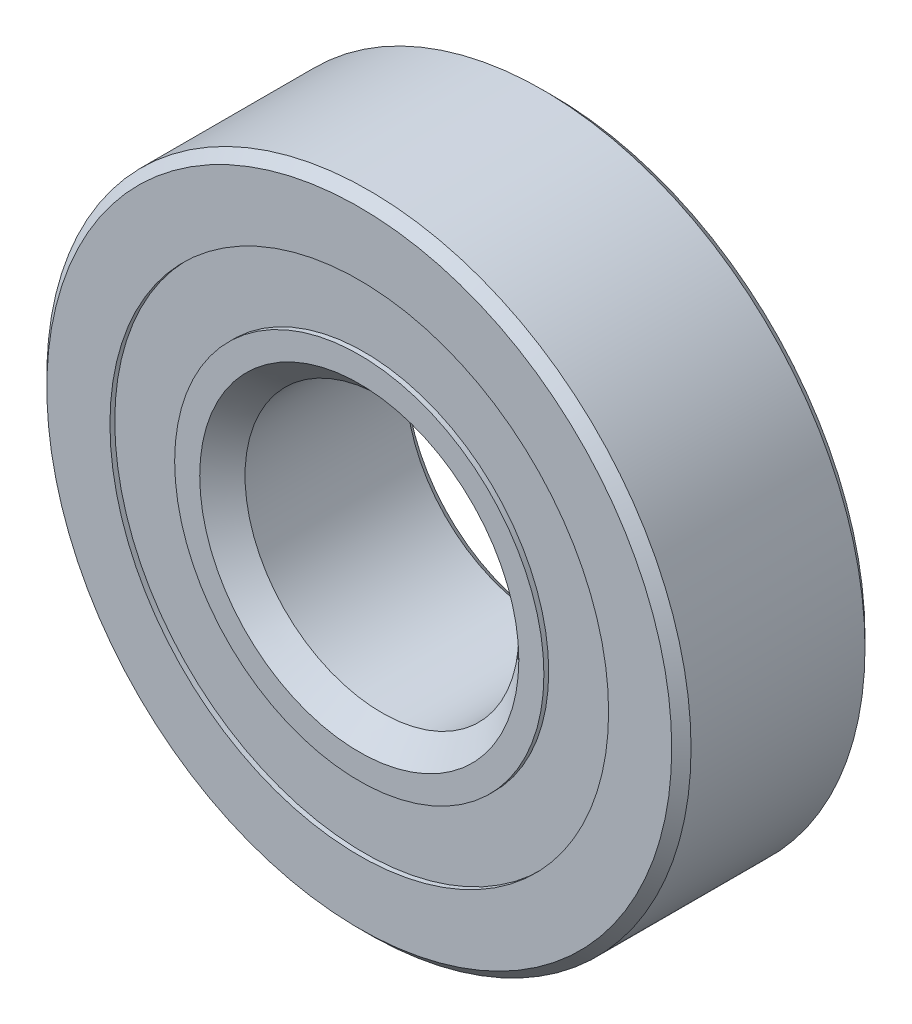
ISO-10303-21;
HEADER;
FILE_DESCRIPTION(('STEP AP214'),'2;1');
FILE_NAME('part.step','',(''),(''),'','','');
FILE_SCHEMA(('AUTOMOTIVE_DESIGN { 1 0 10303 214 1 1 1 1 }'));
ENDSEC;
DATA;
#1=APPLICATION_CONTEXT('core data for automotive mechanical design processes');
#2=APPLICATION_PROTOCOL_DEFINITION('international standard','automotive_design',2000,#1);
#3=PRODUCT_CONTEXT('',#1,'mechanical');
#4=PRODUCT('Part','Part','',(#3));
#5=PRODUCT_RELATED_PRODUCT_CATEGORY('part','',(#4));
#6=PRODUCT_DEFINITION_FORMATION('','',#4);
#7=PRODUCT_DEFINITION_CONTEXT('part definition',#1,'design');
#8=PRODUCT_DEFINITION('design','',#6,#7);
#9=PRODUCT_DEFINITION_SHAPE('','',#8);
#10=(LENGTH_UNIT() NAMED_UNIT(*) SI_UNIT(.MILLI.,.METRE.));
#11=(NAMED_UNIT(*) PLANE_ANGLE_UNIT() SI_UNIT($,.RADIAN.));
#12=(NAMED_UNIT(*) SI_UNIT($,.STERADIAN.) SOLID_ANGLE_UNIT());
#13=UNCERTAINTY_MEASURE_WITH_UNIT(LENGTH_MEASURE(1.E-05),#10,'distance_accuracy_value','');
#14=(GEOMETRIC_REPRESENTATION_CONTEXT(3) GLOBAL_UNCERTAINTY_ASSIGNED_CONTEXT((#13)) GLOBAL_UNIT_ASSIGNED_CONTEXT((#10,
#11,#12)) REPRESENTATION_CONTEXT('',''));
#15=CARTESIAN_POINT('',(0.,0.,0.));
#16=DIRECTION('',(0.,0.,1.));
#17=DIRECTION('',(1.,0.,0.));
#18=AXIS2_PLACEMENT_3D('',#15,#16,#17);
#19=CARTESIAN_POINT('',(0.,15.4807692307692,-5.70000000000001));
#20=DIRECTION('',(0.,0.,1.));
#21=DIRECTION('',(1.,0.,0.));
#22=AXIS2_PLACEMENT_3D('',#19,#20,#21);
#23=PLANE('',#22);
#24=CARTESIAN_POINT('',(0.,0.,-5.70000000000001));
#25=DIRECTION('',(0.,0.,1.));
#26=DIRECTION('',(1.,0.,0.));
#27=AXIS2_PLACEMENT_3D('',#24,#25,#26);
#28=CIRCLE('',#27,15.4807692307692);
#29=CARTESIAN_POINT('',(15.4807692307692,0.,-5.70000000000001));
#30=VERTEX_POINT('',#29);
#31=EDGE_CURVE('E62',#30,#30,#28,.T.);
#32=ORIENTED_EDGE('',*,*,#31,.F.);
#33=EDGE_LOOP('',(#32));
#34=FACE_BOUND('',#33,.T.);
#35=CARTESIAN_POINT('',(0.,0.,-5.70000000000001));
#36=DIRECTION('',(0.,0.,1.));
#37=DIRECTION('',(1.,0.,0.));
#38=AXIS2_PLACEMENT_3D('',#35,#36,#37);
#39=CIRCLE('',#38,11.4628681506012);
#40=CARTESIAN_POINT('',(11.4628681506012,0.,-5.70000000000001));
#41=VERTEX_POINT('',#40);
#42=EDGE_CURVE('E11',#41,#41,#39,.T.);
#43=ORIENTED_EDGE('',*,*,#42,.T.);
#44=EDGE_LOOP('',(#43));
#45=FACE_BOUND('',#44,.T.);
#46=ADVANCED_FACE('F48',(#34,#45),#23,.F.);
#47=CARTESIAN_POINT('',(0.,0.,6.));
#48=DIRECTION('',(0.,0.,1.));
#49=DIRECTION('',(1.,0.,0.));
#50=AXIS2_PLACEMENT_3D('',#47,#48,#49);
#51=CYLINDRICAL_SURFACE('',#50,11.4628681506012);
#52=ORIENTED_EDGE('',*,*,#42,.F.);
#53=EDGE_LOOP('',(#52));
#54=FACE_BOUND('',#53,.T.);
#55=CARTESIAN_POINT('',(0.,0.,-2.93698893605669));
#56=DIRECTION('',(0.,0.,1.));
#57=DIRECTION('',(1.,0.,0.));
#58=AXIS2_PLACEMENT_3D('',#55,#56,#57);
#59=CIRCLE('',#58,11.4628681506012);
#60=CARTESIAN_POINT('',(11.4628681506012,0.,-2.93698893605669));
#61=VERTEX_POINT('',#60);
#62=EDGE_CURVE('E54',#61,#61,#59,.T.);
#63=ORIENTED_EDGE('',*,*,#62,.T.);
#64=EDGE_LOOP('',(#63));
#65=FACE_BOUND('',#64,.T.);
#66=ADVANCED_FACE('F71',(#54,#65),#51,.F.);
#67=CARTESIAN_POINT('',(0.,15.4807692307692,-2.93698893605669));
#68=DIRECTION('',(0.,0.,-1.));
#69=DIRECTION('',(-1.,0.,0.));
#70=AXIS2_PLACEMENT_3D('',#67,#68,#69);
#71=PLANE('',#70);
#72=ORIENTED_EDGE('',*,*,#62,.F.);
#73=EDGE_LOOP('',(#72));
#74=FACE_BOUND('',#73,.T.);
#75=CARTESIAN_POINT('',(0.,0.,-2.93698893605669));
#76=DIRECTION('',(0.,0.,1.));
#77=DIRECTION('',(1.,0.,0.));
#78=AXIS2_PLACEMENT_3D('',#75,#76,#77);
#79=CIRCLE('',#78,15.4807692307692);
#80=CARTESIAN_POINT('',(15.4807692307692,0.,-2.93698893605669));
#81=VERTEX_POINT('',#80);
#82=EDGE_CURVE('E58',#81,#81,#79,.T.);
#83=ORIENTED_EDGE('',*,*,#82,.T.);
#84=EDGE_LOOP('',(#83));
#85=FACE_BOUND('',#84,.T.);
#86=ADVANCED_FACE('F75',(#74,#85),#71,.F.);
#87=CARTESIAN_POINT('',(0.,0.,6.));
#88=DIRECTION('',(0.,0.,1.));
#89=DIRECTION('',(1.,0.,0.));
#90=AXIS2_PLACEMENT_3D('',#87,#88,#89);
#91=CYLINDRICAL_SURFACE('',#90,15.4807692307692);
#92=ORIENTED_EDGE('',*,*,#82,.F.);
#93=EDGE_LOOP('',(#92));
#94=FACE_BOUND('',#93,.T.);
#95=ORIENTED_EDGE('',*,*,#31,.T.);
#96=EDGE_LOOP('',(#95));
#97=FACE_BOUND('',#96,.T.);
#98=ADVANCED_FACE('F68',(#94,#97),#91,.T.);
#99=CLOSED_SHELL('',(#46,#66,#86,#98));
#100=MANIFOLD_SOLID_BREP('B2',#99);
#101=CARTESIAN_POINT('',(0.,15.4807692307692,5.7));
#102=DIRECTION('',(0.,0.,-1.));
#103=DIRECTION('',(-1.,0.,0.));
#104=AXIS2_PLACEMENT_3D('',#101,#102,#103);
#105=PLANE('',#104);
#106=CARTESIAN_POINT('',(0.,0.,5.7));
#107=DIRECTION('',(0.,0.,1.));
#108=DIRECTION('',(1.,0.,0.));
#109=AXIS2_PLACEMENT_3D('',#106,#107,#108);
#110=CIRCLE('',#109,11.4628681506012);
#111=CARTESIAN_POINT('',(11.4628681506012,0.,5.7));
#112=VERTEX_POINT('',#111);
#113=EDGE_CURVE('E47',#112,#112,#110,.T.);
#114=ORIENTED_EDGE('',*,*,#113,.F.);
#115=EDGE_LOOP('',(#114));
#116=FACE_BOUND('',#115,.T.);
#117=CARTESIAN_POINT('',(0.,0.,5.7));
#118=DIRECTION('',(0.,0.,1.));
#119=DIRECTION('',(1.,0.,0.));
#120=AXIS2_PLACEMENT_3D('',#117,#118,#119);
#121=CIRCLE('',#120,15.4807692307692);
#122=CARTESIAN_POINT('',(15.4807692307692,0.,5.7));
#123=VERTEX_POINT('',#122);
#124=EDGE_CURVE('E130',#123,#123,#121,.T.);
#125=ORIENTED_EDGE('',*,*,#124,.T.);
#126=EDGE_LOOP('',(#125));
#127=FACE_BOUND('',#126,.T.);
#128=ADVANCED_FACE('F116',(#116,#127),#105,.F.);
#129=CARTESIAN_POINT('',(0.,0.,6.));
#130=DIRECTION('',(0.,0.,1.));
#131=DIRECTION('',(1.,0.,0.));
#132=AXIS2_PLACEMENT_3D('',#129,#130,#131);
#133=CYLINDRICAL_SURFACE('',#132,11.4628681506012);
#134=CARTESIAN_POINT('',(0.,0.,2.93698893605669));
#135=DIRECTION('',(0.,0.,1.));
#136=DIRECTION('',(1.,0.,0.));
#137=AXIS2_PLACEMENT_3D('',#134,#135,#136);
#138=CIRCLE('',#137,11.4628681506012);
#139=CARTESIAN_POINT('',(11.4628681506012,0.,2.93698893605669));
#140=VERTEX_POINT('',#139);
#141=EDGE_CURVE('E122',#140,#140,#138,.T.);
#142=ORIENTED_EDGE('',*,*,#141,.F.);
#143=EDGE_LOOP('',(#142));
#144=FACE_BOUND('',#143,.T.);
#145=ORIENTED_EDGE('',*,*,#113,.T.);
#146=EDGE_LOOP('',(#145));
#147=FACE_BOUND('',#146,.T.);
#148=ADVANCED_FACE('F145',(#144,#147),#133,.F.);
#149=CARTESIAN_POINT('',(0.,15.4807692307692,2.93698893605669));
#150=DIRECTION('',(0.,0.,1.));
#151=DIRECTION('',(1.,0.,0.));
#152=AXIS2_PLACEMENT_3D('',#149,#150,#151);
#153=PLANE('',#152);
#154=CARTESIAN_POINT('',(0.,0.,2.93698893605669));
#155=DIRECTION('',(0.,0.,1.));
#156=DIRECTION('',(1.,0.,0.));
#157=AXIS2_PLACEMENT_3D('',#154,#155,#156);
#158=CIRCLE('',#157,15.4807692307692);
#159=CARTESIAN_POINT('',(15.4807692307692,0.,2.93698893605669));
#160=VERTEX_POINT('',#159);
#161=EDGE_CURVE('E126',#160,#160,#158,.T.);
#162=ORIENTED_EDGE('',*,*,#161,.F.);
#163=EDGE_LOOP('',(#162));
#164=FACE_BOUND('',#163,.T.);
#165=ORIENTED_EDGE('',*,*,#141,.T.);
#166=EDGE_LOOP('',(#165));
#167=FACE_BOUND('',#166,.T.);
#168=ADVANCED_FACE('F140',(#164,#167),#153,.F.);
#169=CARTESIAN_POINT('',(0.,0.,6.));
#170=DIRECTION('',(0.,0.,1.));
#171=DIRECTION('',(1.,0.,0.));
#172=AXIS2_PLACEMENT_3D('',#169,#170,#171);
#173=CYLINDRICAL_SURFACE('',#172,15.4807692307692);
#174=ORIENTED_EDGE('',*,*,#124,.F.);
#175=EDGE_LOOP('',(#174));
#176=FACE_BOUND('',#175,.T.);
#177=ORIENTED_EDGE('',*,*,#161,.T.);
#178=EDGE_LOOP('',(#177));
#179=FACE_BOUND('',#178,.T.);
#180=ADVANCED_FACE('F137',(#176,#179),#173,.T.);
#181=CLOSED_SHELL('',(#128,#148,#168,#180));
#182=MANIFOLD_SOLID_BREP('B6',#181);
#183=CARTESIAN_POINT('',(-7.12499999999984,12.3408620039283,0.));
#184=DIRECTION('',(0.,0.,1.));
#185=DIRECTION('',(-0.499999999999989,0.866025403784445,0.));
#186=AXIS2_PLACEMENT_3D('',#183,#184,#185);
#187=SPHERICAL_SURFACE('',#186,2.93698893605669);
#188=CARTESIAN_POINT('',(-7.12499999999984,12.3408620039283,2.93698893605668));
#189=VERTEX_POINT('',#188);
#190=VERTEX_LOOP('',#189);
#191=FACE_BOUND('',#190,.T.);
#192=ADVANCED_FACE('F205',(#191),#187,.T.);
#193=CLOSED_SHELL('',(#192));
#194=MANIFOLD_SOLID_BREP('B42',#193);
#195=CARTESIAN_POINT('',(-12.3408620039282,7.12500000000014,0.));
#196=DIRECTION('',(0.,0.,1.));
#197=DIRECTION('',(-0.866025403784433,0.50000000000001,0.));
#198=AXIS2_PLACEMENT_3D('',#195,#196,#197);
#199=SPHERICAL_SURFACE('',#198,2.93698893605669);
#200=CARTESIAN_POINT('',(-12.3408620039282,7.12500000000014,2.93698893605668));
#201=VERTEX_POINT('',#200);
#202=VERTEX_LOOP('',#201);
#203=FACE_BOUND('',#202,.T.);
#204=ADVANCED_FACE('F241',(#203),#199,.T.);
#205=CLOSED_SHELL('',(#204));
#206=MANIFOLD_SOLID_BREP('B112',#205);
#207=CARTESIAN_POINT('',(-14.25,1.49260827235544E-13,0.));
#208=DIRECTION('',(0.,0.,1.));
#209=DIRECTION('',(-1.,0.,0.));
#210=AXIS2_PLACEMENT_3D('',#207,#208,#209);
#211=SPHERICAL_SURFACE('',#210,2.93698893605669);
#212=CARTESIAN_POINT('',(-14.25,1.49260827235544E-13,2.93698893605668));
#213=VERTEX_POINT('',#212);
#214=VERTEX_LOOP('',#213);
#215=FACE_BOUND('',#214,.T.);
#216=ADVANCED_FACE('F278',(#215),#211,.T.);
#217=CLOSED_SHELL('',(#216));
#218=MANIFOLD_SOLID_BREP('B201',#217);
#219=CARTESIAN_POINT('',(-12.3408620039283,-7.12499999999989,0.));
#220=DIRECTION('',(0.,0.,1.));
#221=DIRECTION('',(-0.866025403784443,-0.499999999999992,0.));
#222=AXIS2_PLACEMENT_3D('',#219,#220,#221);
#223=SPHERICAL_SURFACE('',#222,2.93698893605669);
#224=CARTESIAN_POINT('',(-12.3408620039283,-7.12499999999989,2.93698893605668));
#225=VERTEX_POINT('',#224);
#226=VERTEX_LOOP('',#225);
#227=FACE_BOUND('',#226,.T.);
#228=ADVANCED_FACE('F311',(#227),#223,.T.);
#229=CLOSED_SHELL('',(#228));
#230=MANIFOLD_SOLID_BREP('B237',#229);
#231=CARTESIAN_POINT('',(-7.1250000000001,-12.3408620039282,0.));
#232=DIRECTION('',(0.,0.,1.));
#233=DIRECTION('',(-0.500000000000007,-0.866025403784435,0.));
#234=AXIS2_PLACEMENT_3D('',#231,#232,#233);
#235=SPHERICAL_SURFACE('',#234,2.93698893605669);
#236=CARTESIAN_POINT('',(-7.1250000000001,-12.3408620039282,2.93698893605668));
#237=VERTEX_POINT('',#236);
#238=VERTEX_LOOP('',#237);
#239=FACE_BOUND('',#238,.T.);
#240=ADVANCED_FACE('F344',(#239),#235,.T.);
#241=CLOSED_SHELL('',(#240));
#242=MANIFOLD_SOLID_BREP('B274',#241);
#243=CARTESIAN_POINT('',(0.,-14.25,0.));
#244=DIRECTION('',(0.,0.,1.));
#245=DIRECTION('',(0.,-1.,0.));
#246=AXIS2_PLACEMENT_3D('',#243,#244,#245);
#247=SPHERICAL_SURFACE('',#246,2.93698893605669);
#248=CARTESIAN_POINT('',(0.,-14.25,2.93698893605668));
#249=VERTEX_POINT('',#248);
#250=VERTEX_LOOP('',#249);
#251=FACE_BOUND('',#250,.T.);
#252=ADVANCED_FACE('F377',(#251),#247,.T.);
#253=CLOSED_SHELL('',(#252));
#254=MANIFOLD_SOLID_BREP('B307',#253);
#255=CARTESIAN_POINT('',(7.12499999999993,-12.3408620039283,0.));
#256=DIRECTION('',(0.,0.,1.));
#257=DIRECTION('',(0.499999999999995,-0.866025403784442,0.));
#258=AXIS2_PLACEMENT_3D('',#255,#256,#257);
#259=SPHERICAL_SURFACE('',#258,2.93698893605669);
#260=CARTESIAN_POINT('',(7.12499999999993,-12.3408620039283,2.93698893605668));
#261=VERTEX_POINT('',#260);
#262=VERTEX_LOOP('',#261);
#263=FACE_BOUND('',#262,.T.);
#264=ADVANCED_FACE('F410',(#263),#259,.T.);
#265=CLOSED_SHELL('',(#264));
#266=MANIFOLD_SOLID_BREP('B340',#265);
#267=CARTESIAN_POINT('',(12.3408620039282,-7.12500000000006,0.));
#268=DIRECTION('',(0.,0.,1.));
#269=DIRECTION('',(0.866025403784436,-0.500000000000004,0.));
#270=AXIS2_PLACEMENT_3D('',#267,#268,#269);
#271=SPHERICAL_SURFACE('',#270,2.93698893605669);
#272=CARTESIAN_POINT('',(12.3408620039282,-7.12500000000006,2.93698893605668));
#273=VERTEX_POINT('',#272);
#274=VERTEX_LOOP('',#273);
#275=FACE_BOUND('',#274,.T.);
#276=ADVANCED_FACE('F443',(#275),#271,.T.);
#277=CLOSED_SHELL('',(#276));
#278=MANIFOLD_SOLID_BREP('B373',#277);
#279=CARTESIAN_POINT('',(14.25,0.,0.));
#280=DIRECTION('',(0.,0.,1.));
#281=DIRECTION('',(1.,0.,0.));
#282=AXIS2_PLACEMENT_3D('',#279,#280,#281);
#283=SPHERICAL_SURFACE('',#282,2.93698893605669);
#284=CARTESIAN_POINT('',(14.25,0.,2.93698893605668));
#285=VERTEX_POINT('',#284);
#286=VERTEX_LOOP('',#285);
#287=FACE_BOUND('',#286,.T.);
#288=ADVANCED_FACE('F476',(#287),#283,.T.);
#289=CLOSED_SHELL('',(#288));
#290=MANIFOLD_SOLID_BREP('B406',#289);
#291=CARTESIAN_POINT('',(12.3408620039283,7.12499999999997,0.));
#292=DIRECTION('',(0.,0.,1.));
#293=DIRECTION('',(0.86602540378444,0.499999999999998,0.));
#294=AXIS2_PLACEMENT_3D('',#291,#292,#293);
#295=SPHERICAL_SURFACE('',#294,2.93698893605669);
#296=CARTESIAN_POINT('',(12.3408620039283,7.12499999999997,2.93698893605668));
#297=VERTEX_POINT('',#296);
#298=VERTEX_LOOP('',#297);
#299=FACE_BOUND('',#298,.T.);
#300=ADVANCED_FACE('F509',(#299),#295,.T.);
#301=CLOSED_SHELL('',(#300));
#302=MANIFOLD_SOLID_BREP('B439',#301);
#303=CARTESIAN_POINT('',(7.12500000000001,12.3408620039282,0.));
#304=DIRECTION('',(0.,0.,1.));
#305=DIRECTION('',(0.500000000000001,0.866025403784438,0.));
#306=AXIS2_PLACEMENT_3D('',#303,#304,#305);
#307=SPHERICAL_SURFACE('',#306,2.93698893605669);
#308=CARTESIAN_POINT('',(7.12500000000001,12.3408620039282,2.93698893605668));
#309=VERTEX_POINT('',#308);
#310=VERTEX_LOOP('',#309);
#311=FACE_BOUND('',#310,.T.);
#312=ADVANCED_FACE('F542',(#311),#307,.T.);
#313=CLOSED_SHELL('',(#312));
#314=MANIFOLD_SOLID_BREP('B472',#313);
#315=CARTESIAN_POINT('',(0.,14.25,0.));
#316=DIRECTION('',(0.,0.,1.));
#317=DIRECTION('',(0.,1.,0.));
#318=AXIS2_PLACEMENT_3D('',#315,#316,#317);
#319=SPHERICAL_SURFACE('',#318,2.93698893605669);
#320=CARTESIAN_POINT('',(0.,14.25,2.93698893605668));
#321=VERTEX_POINT('',#320);
#322=VERTEX_LOOP('',#321);
#323=FACE_BOUND('',#322,.T.);
#324=ADVANCED_FACE('F577',(#323),#319,.T.);
#325=CLOSED_SHELL('',(#324));
#326=MANIFOLD_SOLID_BREP('B505',#325);
#327=CARTESIAN_POINT('',(0.,0.,6.));
#328=DIRECTION('',(0.,0.,1.));
#329=DIRECTION('',(1.,0.,0.));
#330=AXIS2_PLACEMENT_3D('',#327,#328,#329);
#331=CYLINDRICAL_SURFACE('',#330,11.4628681506012);
#332=CARTESIAN_POINT('',(0.,0.,6.));
#333=DIRECTION('',(0.,0.,1.));
#334=DIRECTION('',(1.,0.,0.));
#335=AXIS2_PLACEMENT_3D('',#332,#333,#334);
#336=CIRCLE('',#335,11.4628681506012);
#337=CARTESIAN_POINT('',(11.4628681506012,0.,6.));
#338=VERTEX_POINT('',#337);
#339=EDGE_CURVE('E637',#338,#338,#336,.T.);
#340=ORIENTED_EDGE('',*,*,#339,.F.);
#341=EDGE_LOOP('',(#340));
#342=FACE_BOUND('',#341,.T.);
#343=CARTESIAN_POINT('',(0.,0.,5.7));
#344=DIRECTION('',(0.,0.,1.));
#345=DIRECTION('',(1.,0.,0.));
#346=AXIS2_PLACEMENT_3D('',#343,#344,#345);
#347=CIRCLE('',#346,11.4628681506012);
#348=CARTESIAN_POINT('',(11.4628681506012,0.,5.7));
#349=VERTEX_POINT('',#348);
#350=EDGE_CURVE('E576',#349,#349,#347,.T.);
#351=ORIENTED_EDGE('',*,*,#350,.T.);
#352=EDGE_LOOP('',(#351));
#353=FACE_BOUND('',#352,.T.);
#354=ADVANCED_FACE('F597',(#342,#353),#331,.T.);
#355=CARTESIAN_POINT('',(0.,11.4628681506012,5.7));
#356=DIRECTION('',(0.,0.,1.));
#357=DIRECTION('',(1.,0.,0.));
#358=AXIS2_PLACEMENT_3D('',#355,#356,#357);
#359=PLANE('',#358);
#360=ORIENTED_EDGE('',*,*,#350,.F.);
#361=EDGE_LOOP('',(#360));
#362=FACE_BOUND('',#361,.T.);
#363=CARTESIAN_POINT('',(0.,0.,5.7));
#364=DIRECTION('',(0.,0.,1.));
#365=DIRECTION('',(1.,0.,0.));
#366=AXIS2_PLACEMENT_3D('',#363,#364,#365);
#367=CIRCLE('',#366,11.1628681506012);
#368=CARTESIAN_POINT('',(11.1628681506012,0.,5.7));
#369=VERTEX_POINT('',#368);
#370=EDGE_CURVE('E603',#369,#369,#367,.T.);
#371=ORIENTED_EDGE('',*,*,#370,.T.);
#372=EDGE_LOOP('',(#371));
#373=FACE_BOUND('',#372,.T.);
#374=ADVANCED_FACE('F644',(#362,#373),#359,.F.);
#375=CARTESIAN_POINT('',(0.,0.,4.44363738137045));
#376=DIRECTION('',(0.,0.,1.));
#377=DIRECTION('',(1.,0.,0.));
#378=AXIS2_PLACEMENT_3D('',#375,#376,#377);
#379=CONICAL_SURFACE('',#378,9.90650553197166,0.78539816339745);
#380=ORIENTED_EDGE('',*,*,#370,.F.);
#381=EDGE_LOOP('',(#380));
#382=FACE_BOUND('',#381,.T.);
#383=CARTESIAN_POINT('',(0.,0.,4.44363738137045));
#384=DIRECTION('',(0.,0.,1.));
#385=DIRECTION('',(1.,0.,0.));
#386=AXIS2_PLACEMENT_3D('',#383,#384,#385);
#387=CIRCLE('',#386,9.90650553197166);
#388=CARTESIAN_POINT('',(9.90650553197166,0.,4.44363738137045));
#389=VERTEX_POINT('',#388);
#390=EDGE_CURVE('E607',#389,#389,#387,.T.);
#391=ORIENTED_EDGE('',*,*,#390,.T.);
#392=EDGE_LOOP('',(#391));
#393=FACE_BOUND('',#392,.T.);
#394=ADVANCED_FACE('F648',(#382,#393),#379,.T.);
#395=CARTESIAN_POINT('',(0.,0.,6.));
#396=DIRECTION('',(0.,0.,1.));
#397=DIRECTION('',(1.,0.,0.));
#398=AXIS2_PLACEMENT_3D('',#395,#396,#397);
#399=CYLINDRICAL_SURFACE('',#398,9.90650553197166);
#400=ORIENTED_EDGE('',*,*,#390,.F.);
#401=EDGE_LOOP('',(#400));
#402=FACE_BOUND('',#401,.T.);
#403=CARTESIAN_POINT('',(0.,0.,0.));
#404=DIRECTION('',(0.,0.,1.));
#405=DIRECTION('',(1.,0.,0.));
#406=AXIS2_PLACEMENT_3D('',#403,#404,#405);
#407=CIRCLE('',#406,9.90650553197166);
#408=CARTESIAN_POINT('',(9.90650553197166,0.,0.));
#409=VERTEX_POINT('',#408);
#410=EDGE_CURVE('E611',#409,#409,#407,.T.);
#411=ORIENTED_EDGE('',*,*,#410,.T.);
#412=EDGE_LOOP('',(#411));
#413=FACE_BOUND('',#412,.T.);
#414=ADVANCED_FACE('F653',(#402,#413),#399,.T.);
#415=CARTESIAN_POINT('',(0.,9.90650553197166,0.));
#416=DIRECTION('',(0.,0.,-1.));
#417=DIRECTION('',(-1.,0.,0.));
#418=AXIS2_PLACEMENT_3D('',#415,#416,#417);
#419=PLANE('',#418);
#420=ORIENTED_EDGE('',*,*,#410,.F.);
#421=EDGE_LOOP('',(#420));
#422=FACE_BOUND('',#421,.T.);
#423=CARTESIAN_POINT('',(0.,0.,0.));
#424=DIRECTION('',(0.,0.,1.));
#425=DIRECTION('',(1.,0.,0.));
#426=AXIS2_PLACEMENT_3D('',#423,#424,#425);
#427=CIRCLE('',#426,11.3130110639433);
#428=CARTESIAN_POINT('',(11.3130110639433,0.,0.));
#429=VERTEX_POINT('',#428);
#430=EDGE_CURVE('E616',#429,#429,#427,.T.);
#431=ORIENTED_EDGE('',*,*,#430,.T.);
#432=EDGE_LOOP('',(#431));
#433=FACE_BOUND('',#432,.T.);
#434=ADVANCED_FACE('F659',(#422,#433),#419,.F.);
#435=CARTESIAN_POINT('',(0.,0.,0.));
#436=DIRECTION('',(0.,0.,1.));
#437=DIRECTION('',(1.,0.,0.));
#438=AXIS2_PLACEMENT_3D('',#435,#436,#437);
#439=TOROIDAL_SURFACE('',#438,14.25,2.93698893605668);
#440=ORIENTED_EDGE('',*,*,#430,.F.);
#441=EDGE_LOOP('',(#440));
#442=FACE_BOUND('',#441,.T.);
#443=CARTESIAN_POINT('',(0.,0.,-2.66666666666667));
#444=DIRECTION('',(0.,0.,1.));
#445=DIRECTION('',(1.,0.,0.));
#446=AXIS2_PLACEMENT_3D('',#443,#444,#445);
#447=CIRCLE('',#446,13.0192307692308);
#448=CARTESIAN_POINT('',(13.0192307692308,0.,-2.66666666666667));
#449=VERTEX_POINT('',#448);
#450=EDGE_CURVE('E619',#449,#449,#447,.T.);
#451=ORIENTED_EDGE('',*,*,#450,.T.);
#452=EDGE_LOOP('',(#451));
#453=FACE_BOUND('',#452,.T.);
#454=ADVANCED_FACE('F663',(#442,#453),#439,.F.);
#455=CARTESIAN_POINT('',(0.,0.,6.));
#456=DIRECTION('',(0.,0.,1.));
#457=DIRECTION('',(1.,0.,0.));
#458=AXIS2_PLACEMENT_3D('',#455,#456,#457);
#459=CYLINDRICAL_SURFACE('',#458,13.0192307692308);
#460=ORIENTED_EDGE('',*,*,#450,.F.);
#461=EDGE_LOOP('',(#460));
#462=FACE_BOUND('',#461,.T.);
#463=CARTESIAN_POINT('',(0.,0.,-6.00000000000001));
#464=DIRECTION('',(0.,0.,1.));
#465=DIRECTION('',(1.,0.,0.));
#466=AXIS2_PLACEMENT_3D('',#463,#464,#465);
#467=CIRCLE('',#466,13.0192307692308);
#468=CARTESIAN_POINT('',(13.0192307692308,0.,-6.00000000000001));
#469=VERTEX_POINT('',#468);
#470=EDGE_CURVE('E622',#469,#469,#467,.T.);
#471=ORIENTED_EDGE('',*,*,#470,.T.);
#472=EDGE_LOOP('',(#471));
#473=FACE_BOUND('',#472,.T.);
#474=ADVANCED_FACE('F667',(#462,#473),#459,.T.);
#475=CARTESIAN_POINT('',(0.,9.1,-6.00000000000001));
#476=DIRECTION('',(0.,0.,1.));
#477=DIRECTION('',(1.,0.,0.));
#478=AXIS2_PLACEMENT_3D('',#475,#476,#477);
#479=PLANE('',#478);
#480=ORIENTED_EDGE('',*,*,#470,.F.);
#481=EDGE_LOOP('',(#480));
#482=FACE_BOUND('',#481,.T.);
#483=CARTESIAN_POINT('',(0.,0.,-6.00000000000001));
#484=DIRECTION('',(0.,0.,1.));
#485=DIRECTION('',(1.,0.,0.));
#486=AXIS2_PLACEMENT_3D('',#483,#484,#485);
#487=CIRCLE('',#486,9.1);
#488=CARTESIAN_POINT('',(9.1,0.,-6.00000000000001));
#489=VERTEX_POINT('',#488);
#490=EDGE_CURVE('E625',#489,#489,#487,.T.);
#491=ORIENTED_EDGE('',*,*,#490,.T.);
#492=EDGE_LOOP('',(#491));
#493=FACE_BOUND('',#492,.T.);
#494=ADVANCED_FACE('F671',(#482,#493),#479,.F.);
#495=CARTESIAN_POINT('',(0.,0.,-5.40000000000001));
#496=DIRECTION('',(0.,0.,-1.));
#497=DIRECTION('',(-1.,0.,0.));
#498=AXIS2_PLACEMENT_3D('',#495,#496,#497);
#499=CONICAL_SURFACE('',#498,8.5,0.785398163397447);
#500=ORIENTED_EDGE('',*,*,#490,.F.);
#501=EDGE_LOOP('',(#500));
#502=FACE_BOUND('',#501,.T.);
#503=CARTESIAN_POINT('',(0.,0.,-5.40000000000001));
#504=DIRECTION('',(0.,0.,1.));
#505=DIRECTION('',(1.,0.,0.));
#506=AXIS2_PLACEMENT_3D('',#503,#504,#505);
#507=CIRCLE('',#506,8.5);
#508=CARTESIAN_POINT('',(8.5,0.,-5.40000000000001));
#509=VERTEX_POINT('',#508);
#510=EDGE_CURVE('E628',#509,#509,#507,.T.);
#511=ORIENTED_EDGE('',*,*,#510,.T.);
#512=EDGE_LOOP('',(#511));
#513=FACE_BOUND('',#512,.T.);
#514=ADVANCED_FACE('F675',(#502,#513),#499,.F.);
#515=CARTESIAN_POINT('',(0.,0.,6.));
#516=DIRECTION('',(0.,0.,1.));
#517=DIRECTION('',(1.,0.,0.));
#518=AXIS2_PLACEMENT_3D('',#515,#516,#517);
#519=CYLINDRICAL_SURFACE('',#518,8.5);
#520=ORIENTED_EDGE('',*,*,#510,.F.);
#521=EDGE_LOOP('',(#520));
#522=FACE_BOUND('',#521,.T.);
#523=CARTESIAN_POINT('',(0.,0.,4.59349446802835));
#524=DIRECTION('',(0.,0.,1.));
#525=DIRECTION('',(1.,0.,0.));
#526=AXIS2_PLACEMENT_3D('',#523,#524,#525);
#527=CIRCLE('',#526,8.5);
#528=CARTESIAN_POINT('',(8.5,0.,4.59349446802835));
#529=VERTEX_POINT('',#528);
#530=EDGE_CURVE('E631',#529,#529,#527,.T.);
#531=ORIENTED_EDGE('',*,*,#530,.T.);
#532=EDGE_LOOP('',(#531));
#533=FACE_BOUND('',#532,.T.);
#534=ADVANCED_FACE('F679',(#522,#533),#519,.F.);
#535=CARTESIAN_POINT('',(0.,0.,6.));
#536=DIRECTION('',(0.,0.,1.));
#537=DIRECTION('',(1.,0.,0.));
#538=AXIS2_PLACEMENT_3D('',#535,#536,#537);
#539=CONICAL_SURFACE('',#538,9.90650553197166,0.78539816339745);
#540=ORIENTED_EDGE('',*,*,#530,.F.);
#541=EDGE_LOOP('',(#540));
#542=FACE_BOUND('',#541,.T.);
#543=CARTESIAN_POINT('',(0.,0.,6.));
#544=DIRECTION('',(0.,0.,1.));
#545=DIRECTION('',(1.,0.,0.));
#546=AXIS2_PLACEMENT_3D('',#543,#544,#545);
#547=CIRCLE('',#546,9.90650553197166);
#548=CARTESIAN_POINT('',(9.90650553197166,0.,6.));
#549=VERTEX_POINT('',#548);
#550=EDGE_CURVE('E634',#549,#549,#547,.T.);
#551=ORIENTED_EDGE('',*,*,#550,.T.);
#552=EDGE_LOOP('',(#551));
#553=FACE_BOUND('',#552,.T.);
#554=ADVANCED_FACE('F683',(#542,#553),#539,.F.);
#555=CARTESIAN_POINT('',(0.,11.4628681506012,6.));
#556=DIRECTION('',(0.,0.,-1.));
#557=DIRECTION('',(-1.,0.,0.));
#558=AXIS2_PLACEMENT_3D('',#555,#556,#557);
#559=PLANE('',#558);
#560=ORIENTED_EDGE('',*,*,#550,.F.);
#561=EDGE_LOOP('',(#560));
#562=FACE_BOUND('',#561,.T.);
#563=ORIENTED_EDGE('',*,*,#339,.T.);
#564=EDGE_LOOP('',(#563));
#565=FACE_BOUND('',#564,.T.);
#566=ADVANCED_FACE('F641',(#562,#565),#559,.F.);
#567=CLOSED_SHELL('',(#354,#374,#394,#414,#434,#454,#474,#494,#514,#534,#554,#566));
#568=MANIFOLD_SOLID_BREP('B538',#567);
#569=CARTESIAN_POINT('',(0.,0.,5.4));
#570=DIRECTION('',(0.,0.,-1.));
#571=DIRECTION('',(-1.,0.,0.));
#572=AXIS2_PLACEMENT_3D('',#569,#570,#571);
#573=CONICAL_SURFACE('',#572,20.,0.785398163397451);
#574=CARTESIAN_POINT('',(0.,0.,6.));
#575=DIRECTION('',(0.,0.,1.));
#576=DIRECTION('',(1.,0.,0.));
#577=AXIS2_PLACEMENT_3D('',#574,#575,#576);
#578=CIRCLE('',#577,19.4);
#579=CARTESIAN_POINT('',(19.4,0.,6.));
#580=VERTEX_POINT('',#579);
#581=EDGE_CURVE('E807',#580,#580,#578,.T.);
#582=ORIENTED_EDGE('',*,*,#581,.F.);
#583=EDGE_LOOP('',(#582));
#584=FACE_BOUND('',#583,.T.);
#585=CARTESIAN_POINT('',(0.,0.,5.4));
#586=DIRECTION('',(0.,0.,1.));
#587=DIRECTION('',(1.,0.,0.));
#588=AXIS2_PLACEMENT_3D('',#585,#586,#587);
#589=CIRCLE('',#588,20.);
#590=CARTESIAN_POINT('',(20.,0.,5.4));
#591=VERTEX_POINT('',#590);
#592=EDGE_CURVE('E596',#591,#591,#589,.T.);
#593=ORIENTED_EDGE('',*,*,#592,.T.);
#594=EDGE_LOOP('',(#593));
#595=FACE_BOUND('',#594,.T.);
#596=ADVANCED_FACE('F779',(#584,#595),#573,.T.);
#597=CARTESIAN_POINT('',(0.,0.,6.));
#598=DIRECTION('',(0.,0.,1.));
#599=DIRECTION('',(1.,0.,0.));
#600=AXIS2_PLACEMENT_3D('',#597,#598,#599);
#601=CYLINDRICAL_SURFACE('',#600,20.);
#602=ORIENTED_EDGE('',*,*,#592,.F.);
#603=EDGE_LOOP('',(#602));
#604=FACE_BOUND('',#603,.T.);
#605=CARTESIAN_POINT('',(0.,0.,-5.40000000000001));
#606=DIRECTION('',(0.,0.,1.));
#607=DIRECTION('',(1.,0.,0.));
#608=AXIS2_PLACEMENT_3D('',#605,#606,#607);
#609=CIRCLE('',#608,20.);
#610=CARTESIAN_POINT('',(20.,0.,-5.40000000000001));
#611=VERTEX_POINT('',#610);
#612=EDGE_CURVE('E785',#611,#611,#609,.T.);
#613=ORIENTED_EDGE('',*,*,#612,.T.);
#614=EDGE_LOOP('',(#613));
#615=FACE_BOUND('',#614,.T.);
#616=ADVANCED_FACE('F814',(#604,#615),#601,.T.);
#617=CARTESIAN_POINT('',(0.,0.,-6.00000000000001));
#618=DIRECTION('',(0.,0.,1.));
#619=DIRECTION('',(1.,0.,0.));
#620=AXIS2_PLACEMENT_3D('',#617,#618,#619);
#621=CONICAL_SURFACE('',#620,19.4,0.785398163397451);
#622=ORIENTED_EDGE('',*,*,#612,.F.);
#623=EDGE_LOOP('',(#622));
#624=FACE_BOUND('',#623,.T.);
#625=CARTESIAN_POINT('',(0.,0.,-6.00000000000001));
#626=DIRECTION('',(0.,0.,1.));
#627=DIRECTION('',(1.,0.,0.));
#628=AXIS2_PLACEMENT_3D('',#625,#626,#627);
#629=CIRCLE('',#628,19.4);
#630=CARTESIAN_POINT('',(19.4,0.,-6.00000000000001));
#631=VERTEX_POINT('',#630);
#632=EDGE_CURVE('E789',#631,#631,#629,.T.);
#633=ORIENTED_EDGE('',*,*,#632,.T.);
#634=EDGE_LOOP('',(#633));
#635=FACE_BOUND('',#634,.T.);
#636=ADVANCED_FACE('F818',(#624,#635),#621,.T.);
#637=CARTESIAN_POINT('',(0.,19.4,-6.00000000000001));
#638=DIRECTION('',(0.,0.,1.));
#639=DIRECTION('',(1.,0.,0.));
#640=AXIS2_PLACEMENT_3D('',#637,#638,#639);
#641=PLANE('',#640);
#642=ORIENTED_EDGE('',*,*,#632,.F.);
#643=EDGE_LOOP('',(#642));
#644=FACE_BOUND('',#643,.T.);
#645=CARTESIAN_POINT('',(0.,0.,-6.00000000000001));
#646=DIRECTION('',(0.,0.,1.));
#647=DIRECTION('',(1.,0.,0.));
#648=AXIS2_PLACEMENT_3D('',#645,#646,#647);
#649=CIRCLE('',#648,15.4807692307692);
#650=CARTESIAN_POINT('',(15.4807692307692,0.,-6.00000000000001));
#651=VERTEX_POINT('',#650);
#652=EDGE_CURVE('E793',#651,#651,#649,.T.);
#653=ORIENTED_EDGE('',*,*,#652,.T.);
#654=EDGE_LOOP('',(#653));
#655=FACE_BOUND('',#654,.T.);
#656=ADVANCED_FACE('F823',(#644,#655),#641,.F.);
#657=CARTESIAN_POINT('',(0.,0.,6.));
#658=DIRECTION('',(0.,0.,1.));
#659=DIRECTION('',(1.,0.,0.));
#660=AXIS2_PLACEMENT_3D('',#657,#658,#659);
#661=CYLINDRICAL_SURFACE('',#660,15.4807692307692);
#662=ORIENTED_EDGE('',*,*,#652,.F.);
#663=EDGE_LOOP('',(#662));
#664=FACE_BOUND('',#663,.T.);
#665=CARTESIAN_POINT('',(0.,0.,-2.66666666666667));
#666=DIRECTION('',(0.,0.,1.));
#667=DIRECTION('',(1.,0.,0.));
#668=AXIS2_PLACEMENT_3D('',#665,#666,#667);
#669=CIRCLE('',#668,15.4807692307692);
#670=CARTESIAN_POINT('',(15.4807692307692,0.,-2.66666666666667));
#671=VERTEX_POINT('',#670);
#672=EDGE_CURVE('E798',#671,#671,#669,.T.);
#673=ORIENTED_EDGE('',*,*,#672,.T.);
#674=EDGE_LOOP('',(#673));
#675=FACE_BOUND('',#674,.T.);
#676=ADVANCED_FACE('F829',(#664,#675),#661,.F.);
#677=CARTESIAN_POINT('',(0.,0.,0.));
#678=DIRECTION('',(0.,0.,1.));
#679=DIRECTION('',(1.,0.,0.));
#680=AXIS2_PLACEMENT_3D('',#677,#678,#679);
#681=TOROIDAL_SURFACE('',#680,14.25,2.93698893605669);
#682=ORIENTED_EDGE('',*,*,#672,.F.);
#683=EDGE_LOOP('',(#682));
#684=FACE_BOUND('',#683,.T.);
#685=CARTESIAN_POINT('',(0.,0.,2.66666666666666));
#686=DIRECTION('',(0.,0.,1.));
#687=DIRECTION('',(1.,0.,0.));
#688=AXIS2_PLACEMENT_3D('',#685,#686,#687);
#689=CIRCLE('',#688,15.4807692307692);
#690=CARTESIAN_POINT('',(15.4807692307692,0.,2.66666666666666));
#691=VERTEX_POINT('',#690);
#692=EDGE_CURVE('E801',#691,#691,#689,.T.);
#693=ORIENTED_EDGE('',*,*,#692,.T.);
#694=EDGE_LOOP('',(#693));
#695=FACE_BOUND('',#694,.T.);
#696=ADVANCED_FACE('F833',(#684,#695),#681,.F.);
#697=CARTESIAN_POINT('',(0.,0.,6.));
#698=DIRECTION('',(0.,0.,1.));
#699=DIRECTION('',(1.,0.,0.));
#700=AXIS2_PLACEMENT_3D('',#697,#698,#699);
#701=CYLINDRICAL_SURFACE('',#700,15.4807692307692);
#702=ORIENTED_EDGE('',*,*,#692,.F.);
#703=EDGE_LOOP('',(#702));
#704=FACE_BOUND('',#703,.T.);
#705=CARTESIAN_POINT('',(0.,0.,6.));
#706=DIRECTION('',(0.,0.,1.));
#707=DIRECTION('',(1.,0.,0.));
#708=AXIS2_PLACEMENT_3D('',#705,#706,#707);
#709=CIRCLE('',#708,15.4807692307692);
#710=CARTESIAN_POINT('',(15.4807692307692,0.,6.));
#711=VERTEX_POINT('',#710);
#712=EDGE_CURVE('E804',#711,#711,#709,.T.);
#713=ORIENTED_EDGE('',*,*,#712,.T.);
#714=EDGE_LOOP('',(#713));
#715=FACE_BOUND('',#714,.T.);
#716=ADVANCED_FACE('F837',(#704,#715),#701,.F.);
#717=CARTESIAN_POINT('',(0.,19.4,6.));
#718=DIRECTION('',(0.,0.,-1.));
#719=DIRECTION('',(-1.,0.,0.));
#720=AXIS2_PLACEMENT_3D('',#717,#718,#719);
#721=PLANE('',#720);
#722=ORIENTED_EDGE('',*,*,#712,.F.);
#723=EDGE_LOOP('',(#722));
#724=FACE_BOUND('',#723,.T.);
#725=ORIENTED_EDGE('',*,*,#581,.T.);
#726=EDGE_LOOP('',(#725));
#727=FACE_BOUND('',#726,.T.);
#728=ADVANCED_FACE('F811',(#724,#727),#721,.F.);
#729=CLOSED_SHELL('',(#596,#616,#636,#656,#676,#696,#716,#728));
#730=MANIFOLD_SOLID_BREP('B571',#729);
#731=ADVANCED_BREP_SHAPE_REPRESENTATION('',(#18,#100,#182,#194,#206,#218,#230,#242,#254,#266,
#278,#290,#302,#314,#326,#568,#730),#14);
#732=SHAPE_DEFINITION_REPRESENTATION(#9,#731);
ENDSEC;
END-ISO-10303-21;
